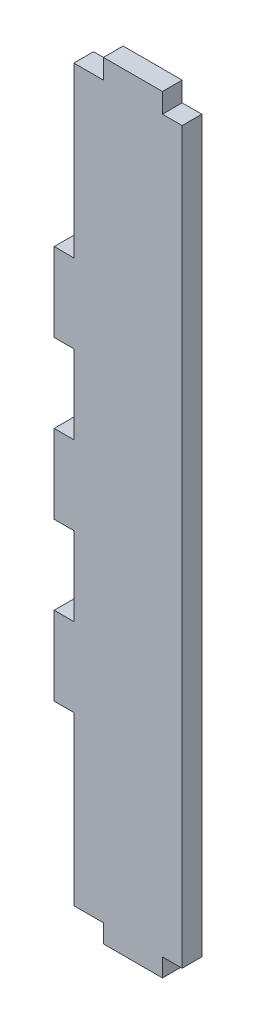
ISO-10303-21;
HEADER;
FILE_DESCRIPTION(('STEP AP214'),'2;1');
FILE_NAME('part.step','',(''),(''),'','','');
FILE_SCHEMA(('AUTOMOTIVE_DESIGN { 1 0 10303 214 1 1 1 1 }'));
ENDSEC;
DATA;
#1=APPLICATION_CONTEXT('core data for automotive mechanical design processes');
#2=APPLICATION_PROTOCOL_DEFINITION('international standard','automotive_design',2000,#1);
#3=PRODUCT_CONTEXT('',#1,'mechanical');
#4=PRODUCT('Part','Part','',(#3));
#5=PRODUCT_RELATED_PRODUCT_CATEGORY('part','',(#4));
#6=PRODUCT_DEFINITION_FORMATION('','',#4);
#7=PRODUCT_DEFINITION_CONTEXT('part definition',#1,'design');
#8=PRODUCT_DEFINITION('design','',#6,#7);
#9=PRODUCT_DEFINITION_SHAPE('','',#8);
#10=(LENGTH_UNIT() NAMED_UNIT(*) SI_UNIT(.MILLI.,.METRE.));
#11=(NAMED_UNIT(*) PLANE_ANGLE_UNIT() SI_UNIT($,.RADIAN.));
#12=(NAMED_UNIT(*) SI_UNIT($,.STERADIAN.) SOLID_ANGLE_UNIT());
#13=UNCERTAINTY_MEASURE_WITH_UNIT(LENGTH_MEASURE(1.E-05),#10,'distance_accuracy_value','');
#14=(GEOMETRIC_REPRESENTATION_CONTEXT(3) GLOBAL_UNCERTAINTY_ASSIGNED_CONTEXT((#13)) GLOBAL_UNIT_ASSIGNED_CONTEXT((#10,
#11,#12)) REPRESENTATION_CONTEXT('',''));
#15=CARTESIAN_POINT('',(0.,0.,0.));
#16=DIRECTION('',(0.,0.,1.));
#17=DIRECTION('',(1.,0.,0.));
#18=AXIS2_PLACEMENT_3D('',#15,#16,#17);
#19=CARTESIAN_POINT('',(-6.80011602582928E-13,122.500000000001,-5.));
#20=DIRECTION('',(0.,1.,0.));
#21=DIRECTION('',(-1.,0.,0.));
#22=AXIS2_PLACEMENT_3D('',#19,#20,#21);
#23=PLANE('',#22);
#24=DIRECTION('',(-1.,0.,0.));
#25=VECTOR('',#24,1.);
#26=CARTESIAN_POINT('',(-6.80011602582928E-13,122.500000000001,0.));
#27=LINE('',#26,#25);
#28=CARTESIAN_POINT('',(24.9999999999859,122.500000000001,0.));
#29=VERTEX_POINT('',#28);
#30=CARTESIAN_POINT('',(19.999999999986,122.500000000001,0.));
#31=VERTEX_POINT('',#30);
#32=EDGE_CURVE('E231',#29,#31,#27,.T.);
#33=ORIENTED_EDGE('',*,*,#32,.T.);
#34=DIRECTION('',(0.,0.,1.));
#35=VECTOR('',#34,1.);
#36=CARTESIAN_POINT('',(19.999999999986,122.500000000001,-5.));
#37=LINE('',#36,#35);
#38=CARTESIAN_POINT('',(19.999999999986,122.500000000001,-5.));
#39=VERTEX_POINT('',#38);
#40=EDGE_CURVE('E11',#39,#31,#37,.T.);
#41=ORIENTED_EDGE('',*,*,#40,.F.);
#42=DIRECTION('',(-1.,0.,0.));
#43=VECTOR('',#42,1.);
#44=CARTESIAN_POINT('',(-6.80011602582928E-13,122.500000000001,-5.));
#45=LINE('',#44,#43);
#46=CARTESIAN_POINT('',(24.9999999999859,122.500000000001,-5.));
#47=VERTEX_POINT('',#46);
#48=EDGE_CURVE('E294',#47,#39,#45,.T.);
#49=ORIENTED_EDGE('',*,*,#48,.F.);
#50=DIRECTION('',(0.,0.,1.));
#51=VECTOR('',#50,1.);
#52=CARTESIAN_POINT('',(24.9999999999859,122.500000000001,-5.));
#53=LINE('',#52,#51);
#54=EDGE_CURVE('E42',#47,#29,#53,.T.);
#55=ORIENTED_EDGE('',*,*,#54,.T.);
#56=EDGE_LOOP('',(#33,#41,#49,#55));
#57=FACE_BOUND('',#56,.T.);
#58=ADVANCED_FACE('F39',(#57),#23,.F.);
#59=CARTESIAN_POINT('',(19.999999999986,0.,-5.));
#60=DIRECTION('',(1.,0.,0.));
#61=DIRECTION('',(0.,0.,-1.));
#62=AXIS2_PLACEMENT_3D('',#59,#60,#61);
#63=PLANE('',#62);
#64=DIRECTION('',(0.,1.,0.));
#65=VECTOR('',#64,1.);
#66=CARTESIAN_POINT('',(19.999999999986,0.,0.));
#67=LINE('',#66,#65);
#68=CARTESIAN_POINT('',(19.999999999986,142.500000000001,0.));
#69=VERTEX_POINT('',#68);
#70=EDGE_CURVE('E138',#31,#69,#67,.T.);
#71=ORIENTED_EDGE('',*,*,#70,.T.);
#72=DIRECTION('',(0.,0.,1.));
#73=VECTOR('',#72,1.);
#74=CARTESIAN_POINT('',(19.999999999986,142.500000000001,-5.));
#75=LINE('',#74,#73);
#76=CARTESIAN_POINT('',(19.999999999986,142.500000000001,-5.));
#77=VERTEX_POINT('',#76);
#78=EDGE_CURVE('E48',#77,#69,#75,.T.);
#79=ORIENTED_EDGE('',*,*,#78,.F.);
#80=DIRECTION('',(0.,1.,0.));
#81=VECTOR('',#80,1.);
#82=CARTESIAN_POINT('',(19.999999999986,0.,-5.));
#83=LINE('',#82,#81);
#84=EDGE_CURVE('E56',#39,#77,#83,.T.);
#85=ORIENTED_EDGE('',*,*,#84,.F.);
#86=ORIENTED_EDGE('',*,*,#40,.T.);
#87=EDGE_LOOP('',(#71,#79,#85,#86));
#88=FACE_BOUND('',#87,.T.);
#89=ADVANCED_FACE('F354',(#88),#63,.F.);
#90=CARTESIAN_POINT('',(-7.91033905045446E-13,142.500000000001,-5.));
#91=DIRECTION('',(0.,1.,0.));
#92=DIRECTION('',(-1.,0.,0.));
#93=AXIS2_PLACEMENT_3D('',#90,#91,#92);
#94=PLANE('',#93);
#95=DIRECTION('',(-1.,0.,0.));
#96=VECTOR('',#95,1.);
#97=CARTESIAN_POINT('',(-7.91033905045446E-13,142.500000000001,0.));
#98=LINE('',#97,#96);
#99=CARTESIAN_POINT('',(24.9999999999859,142.500000000001,0.));
#100=VERTEX_POINT('',#99);
#101=EDGE_CURVE('E210',#100,#69,#98,.T.);
#102=ORIENTED_EDGE('',*,*,#101,.F.);
#103=DIRECTION('',(0.,0.,1.));
#104=VECTOR('',#103,1.);
#105=CARTESIAN_POINT('',(24.9999999999859,142.500000000001,-5.));
#106=LINE('',#105,#104);
#107=CARTESIAN_POINT('',(24.9999999999859,142.500000000001,-5.));
#108=VERTEX_POINT('',#107);
#109=EDGE_CURVE('E206',#108,#100,#106,.T.);
#110=ORIENTED_EDGE('',*,*,#109,.F.);
#111=DIRECTION('',(-1.,0.,0.));
#112=VECTOR('',#111,1.);
#113=CARTESIAN_POINT('',(-7.91033905045446E-13,142.500000000001,-5.));
#114=LINE('',#113,#112);
#115=EDGE_CURVE('E209',#108,#77,#114,.T.);
#116=ORIENTED_EDGE('',*,*,#115,.T.);
#117=ORIENTED_EDGE('',*,*,#78,.T.);
#118=EDGE_LOOP('',(#102,#110,#116,#117));
#119=FACE_BOUND('',#118,.T.);
#120=ADVANCED_FACE('F208',(#119),#94,.T.);
#121=CARTESIAN_POINT('',(24.9999999999769,-1.58057395948201E-12,-5.));
#122=DIRECTION('',(-1.,0.,0.));
#123=DIRECTION('',(0.,-1.,0.));
#124=AXIS2_PLACEMENT_3D('',#121,#122,#123);
#125=PLANE('',#124);
#126=DIRECTION('',(0.,-1.,0.));
#127=VECTOR('',#126,1.);
#128=CARTESIAN_POINT('',(24.9999999999769,-1.58057395948201E-12,0.));
#129=LINE('',#128,#127);
#130=CARTESIAN_POINT('',(24.9999999999886,185.358451090156,0.));
#131=VERTEX_POINT('',#130);
#132=EDGE_CURVE('E291',#131,#100,#129,.T.);
#133=ORIENTED_EDGE('',*,*,#132,.F.);
#134=DIRECTION('',(0.,0.,1.));
#135=VECTOR('',#134,1.);
#136=CARTESIAN_POINT('',(24.9999999999886,185.358451090156,-5.));
#137=LINE('',#136,#135);
#138=CARTESIAN_POINT('',(24.9999999999886,185.358451090156,-5.));
#139=VERTEX_POINT('',#138);
#140=EDGE_CURVE('E215',#139,#131,#137,.T.);
#141=ORIENTED_EDGE('',*,*,#140,.F.);
#142=DIRECTION('',(0.,-1.,0.));
#143=VECTOR('',#142,1.);
#144=CARTESIAN_POINT('',(24.9999999999769,-1.58057395948201E-12,-5.));
#145=LINE('',#144,#143);
#146=EDGE_CURVE('E220',#139,#108,#145,.T.);
#147=ORIENTED_EDGE('',*,*,#146,.T.);
#148=ORIENTED_EDGE('',*,*,#109,.T.);
#149=EDGE_LOOP('',(#133,#141,#147,#148));
#150=FACE_BOUND('',#149,.T.);
#151=ADVANCED_FACE('F222',(#150),#125,.T.);
#152=CARTESIAN_POINT('',(0.,185.358451090156,-5.));
#153=DIRECTION('',(0.,-1.,0.));
#154=DIRECTION('',(0.,0.,-1.));
#155=AXIS2_PLACEMENT_3D('',#152,#153,#154);
#156=PLANE('',#155);
#157=DIRECTION('',(1.,0.,0.));
#158=VECTOR('',#157,1.);
#159=CARTESIAN_POINT('',(0.,185.358451090156,0.));
#160=LINE('',#159,#158);
#161=CARTESIAN_POINT('',(32.4999999999886,185.358451090156,0.));
#162=VERTEX_POINT('',#161);
#163=EDGE_CURVE('E289',#131,#162,#160,.T.);
#164=ORIENTED_EDGE('',*,*,#163,.T.);
#165=DIRECTION('',(0.,0.,1.));
#166=VECTOR('',#165,1.);
#167=CARTESIAN_POINT('',(32.4999999999886,185.358451090156,-5.));
#168=LINE('',#167,#166);
#169=CARTESIAN_POINT('',(32.4999999999886,185.358451090156,-5.));
#170=VERTEX_POINT('',#169);
#171=EDGE_CURVE('E298',#170,#162,#168,.T.);
#172=ORIENTED_EDGE('',*,*,#171,.F.);
#173=DIRECTION('',(1.,0.,0.));
#174=VECTOR('',#173,1.);
#175=CARTESIAN_POINT('',(0.,185.358451090156,-5.));
#176=LINE('',#175,#174);
#177=EDGE_CURVE('E224',#139,#170,#176,.T.);
#178=ORIENTED_EDGE('',*,*,#177,.F.);
#179=ORIENTED_EDGE('',*,*,#140,.T.);
#180=EDGE_LOOP('',(#164,#172,#178,#179));
#181=FACE_BOUND('',#180,.T.);
#182=ADVANCED_FACE('F367',(#181),#156,.F.);
#183=CARTESIAN_POINT('',(32.4999999999886,0.,-5.));
#184=DIRECTION('',(1.,0.,0.));
#185=DIRECTION('',(0.,0.,-1.));
#186=AXIS2_PLACEMENT_3D('',#183,#184,#185);
#187=PLANE('',#186);
#188=DIRECTION('',(0.,1.,0.));
#189=VECTOR('',#188,1.);
#190=CARTESIAN_POINT('',(32.4999999999886,0.,0.));
#191=LINE('',#190,#189);
#192=CARTESIAN_POINT('',(32.4999999999886,190.358451090156,0.));
#193=VERTEX_POINT('',#192);
#194=EDGE_CURVE('E286',#162,#193,#191,.T.);
#195=ORIENTED_EDGE('',*,*,#194,.T.);
#196=DIRECTION('',(0.,0.,1.));
#197=VECTOR('',#196,1.);
#198=CARTESIAN_POINT('',(32.4999999999886,190.358451090156,-5.));
#199=LINE('',#198,#197);
#200=CARTESIAN_POINT('',(32.4999999999886,190.358451090156,-5.));
#201=VERTEX_POINT('',#200);
#202=EDGE_CURVE('E301',#201,#193,#199,.T.);
#203=ORIENTED_EDGE('',*,*,#202,.F.);
#204=DIRECTION('',(0.,1.,0.));
#205=VECTOR('',#204,1.);
#206=CARTESIAN_POINT('',(32.4999999999886,0.,-5.));
#207=LINE('',#206,#205);
#208=EDGE_CURVE('E226',#170,#201,#207,.T.);
#209=ORIENTED_EDGE('',*,*,#208,.F.);
#210=ORIENTED_EDGE('',*,*,#171,.T.);
#211=EDGE_LOOP('',(#195,#203,#209,#210));
#212=FACE_BOUND('',#211,.T.);
#213=ADVANCED_FACE('F370',(#212),#187,.F.);
#214=CARTESIAN_POINT('',(0.,190.358451090156,-5.));
#215=DIRECTION('',(0.,1.,0.));
#216=DIRECTION('',(0.,0.,1.));
#217=AXIS2_PLACEMENT_3D('',#214,#215,#216);
#218=PLANE('',#217);
#219=DIRECTION('',(-1.,0.,0.));
#220=VECTOR('',#219,1.);
#221=CARTESIAN_POINT('',(0.,190.358451090156,0.));
#222=LINE('',#221,#220);
#223=CARTESIAN_POINT('',(47.4999999999886,190.358451090156,0.));
#224=VERTEX_POINT('',#223);
#225=EDGE_CURVE('E283',#224,#193,#222,.T.);
#226=ORIENTED_EDGE('',*,*,#225,.F.);
#227=DIRECTION('',(0.,0.,1.));
#228=VECTOR('',#227,1.);
#229=CARTESIAN_POINT('',(47.4999999999886,190.358451090156,-5.));
#230=LINE('',#229,#228);
#231=CARTESIAN_POINT('',(47.4999999999886,190.358451090156,-5.));
#232=VERTEX_POINT('',#231);
#233=EDGE_CURVE('E303',#232,#224,#230,.T.);
#234=ORIENTED_EDGE('',*,*,#233,.F.);
#235=DIRECTION('',(-1.,0.,0.));
#236=VECTOR('',#235,1.);
#237=CARTESIAN_POINT('',(0.,190.358451090156,-5.));
#238=LINE('',#237,#236);
#239=EDGE_CURVE('E490',#232,#201,#238,.T.);
#240=ORIENTED_EDGE('',*,*,#239,.T.);
#241=ORIENTED_EDGE('',*,*,#202,.T.);
#242=EDGE_LOOP('',(#226,#234,#240,#241));
#243=FACE_BOUND('',#242,.T.);
#244=ADVANCED_FACE('F374',(#243),#218,.T.);
#245=CARTESIAN_POINT('',(47.4999999999886,0.,-5.));
#246=DIRECTION('',(1.,0.,0.));
#247=DIRECTION('',(0.,0.,-1.));
#248=AXIS2_PLACEMENT_3D('',#245,#246,#247);
#249=PLANE('',#248);
#250=DIRECTION('',(0.,1.,0.));
#251=VECTOR('',#250,1.);
#252=CARTESIAN_POINT('',(47.4999999999886,0.,0.));
#253=LINE('',#252,#251);
#254=CARTESIAN_POINT('',(47.4999999999886,185.358451090156,0.));
#255=VERTEX_POINT('',#254);
#256=EDGE_CURVE('E280',#255,#224,#253,.T.);
#257=ORIENTED_EDGE('',*,*,#256,.F.);
#258=DIRECTION('',(0.,0.,1.));
#259=VECTOR('',#258,1.);
#260=CARTESIAN_POINT('',(47.4999999999886,185.358451090156,-5.));
#261=LINE('',#260,#259);
#262=CARTESIAN_POINT('',(47.4999999999886,185.358451090156,-5.));
#263=VERTEX_POINT('',#262);
#264=EDGE_CURVE('E305',#263,#255,#261,.T.);
#265=ORIENTED_EDGE('',*,*,#264,.F.);
#266=DIRECTION('',(0.,1.,0.));
#267=VECTOR('',#266,1.);
#268=CARTESIAN_POINT('',(47.4999999999886,0.,-5.));
#269=LINE('',#268,#267);
#270=EDGE_CURVE('E487',#263,#232,#269,.T.);
#271=ORIENTED_EDGE('',*,*,#270,.T.);
#272=ORIENTED_EDGE('',*,*,#233,.T.);
#273=EDGE_LOOP('',(#257,#265,#271,#272));
#274=FACE_BOUND('',#273,.T.);
#275=ADVANCED_FACE('F378',(#274),#249,.T.);
#276=CARTESIAN_POINT('',(0.,185.358451090156,-5.));
#277=DIRECTION('',(0.,-1.,0.));
#278=DIRECTION('',(0.,0.,-1.));
#279=AXIS2_PLACEMENT_3D('',#276,#277,#278);
#280=PLANE('',#279);
#281=DIRECTION('',(1.,0.,0.));
#282=VECTOR('',#281,1.);
#283=CARTESIAN_POINT('',(0.,185.358451090156,0.));
#284=LINE('',#283,#282);
#285=CARTESIAN_POINT('',(52.4999999999886,185.358451090156,0.));
#286=VERTEX_POINT('',#285);
#287=EDGE_CURVE('E277',#255,#286,#284,.T.);
#288=ORIENTED_EDGE('',*,*,#287,.T.);
#289=DIRECTION('',(0.,0.,1.));
#290=VECTOR('',#289,1.);
#291=CARTESIAN_POINT('',(52.4999999999886,185.358451090156,-5.));
#292=LINE('',#291,#290);
#293=CARTESIAN_POINT('',(52.4999999999886,185.358451090156,-5.));
#294=VERTEX_POINT('',#293);
#295=EDGE_CURVE('E307',#294,#286,#292,.T.);
#296=ORIENTED_EDGE('',*,*,#295,.F.);
#297=DIRECTION('',(1.,0.,0.));
#298=VECTOR('',#297,1.);
#299=CARTESIAN_POINT('',(0.,185.358451090156,-5.));
#300=LINE('',#299,#298);
#301=EDGE_CURVE('E485',#263,#294,#300,.T.);
#302=ORIENTED_EDGE('',*,*,#301,.F.);
#303=ORIENTED_EDGE('',*,*,#264,.T.);
#304=EDGE_LOOP('',(#288,#296,#302,#303));
#305=FACE_BOUND('',#304,.T.);
#306=ADVANCED_FACE('F382',(#305),#280,.F.);
#307=CARTESIAN_POINT('',(52.4999999999886,0.,-5.));
#308=DIRECTION('',(1.,0.,0.));
#309=DIRECTION('',(0.,0.,-1.));
#310=AXIS2_PLACEMENT_3D('',#307,#308,#309);
#311=PLANE('',#310);
#312=DIRECTION('',(0.,1.,0.));
#313=VECTOR('',#312,1.);
#314=CARTESIAN_POINT('',(52.4999999999886,0.,0.));
#315=LINE('',#314,#313);
#316=CARTESIAN_POINT('',(52.4999999999886,0.,0.));
#317=VERTEX_POINT('',#316);
#318=EDGE_CURVE('E274',#317,#286,#315,.T.);
#319=ORIENTED_EDGE('',*,*,#318,.F.);
#320=DIRECTION('',(0.,0.,1.));
#321=VECTOR('',#320,1.);
#322=CARTESIAN_POINT('',(52.4999999999886,0.,-5.));
#323=LINE('',#322,#321);
#324=CARTESIAN_POINT('',(52.4999999999886,0.,-5.));
#325=VERTEX_POINT('',#324);
#326=EDGE_CURVE('E309',#325,#317,#323,.T.);
#327=ORIENTED_EDGE('',*,*,#326,.F.);
#328=DIRECTION('',(0.,1.,0.));
#329=VECTOR('',#328,1.);
#330=CARTESIAN_POINT('',(52.4999999999886,0.,-5.));
#331=LINE('',#330,#329);
#332=EDGE_CURVE('E482',#325,#294,#331,.T.);
#333=ORIENTED_EDGE('',*,*,#332,.T.);
#334=ORIENTED_EDGE('',*,*,#295,.T.);
#335=EDGE_LOOP('',(#319,#327,#333,#334));
#336=FACE_BOUND('',#335,.T.);
#337=ADVANCED_FACE('F386',(#336),#311,.T.);
#338=CARTESIAN_POINT('',(0.,0.,-5.));
#339=DIRECTION('',(0.,-1.,0.));
#340=DIRECTION('',(0.,0.,-1.));
#341=AXIS2_PLACEMENT_3D('',#338,#339,#340);
#342=PLANE('',#341);
#343=DIRECTION('',(1.,0.,0.));
#344=VECTOR('',#343,1.);
#345=CARTESIAN_POINT('',(0.,0.,0.));
#346=LINE('',#345,#344);
#347=CARTESIAN_POINT('',(47.4999999999886,0.,0.));
#348=VERTEX_POINT('',#347);
#349=EDGE_CURVE('E271',#348,#317,#346,.T.);
#350=ORIENTED_EDGE('',*,*,#349,.F.);
#351=DIRECTION('',(0.,0.,1.));
#352=VECTOR('',#351,1.);
#353=CARTESIAN_POINT('',(47.4999999999886,0.,-5.));
#354=LINE('',#353,#352);
#355=CARTESIAN_POINT('',(47.4999999999886,0.,-5.));
#356=VERTEX_POINT('',#355);
#357=EDGE_CURVE('E311',#356,#348,#354,.T.);
#358=ORIENTED_EDGE('',*,*,#357,.F.);
#359=DIRECTION('',(1.,0.,0.));
#360=VECTOR('',#359,1.);
#361=CARTESIAN_POINT('',(0.,0.,-5.));
#362=LINE('',#361,#360);
#363=EDGE_CURVE('E479',#356,#325,#362,.T.);
#364=ORIENTED_EDGE('',*,*,#363,.T.);
#365=ORIENTED_EDGE('',*,*,#326,.T.);
#366=EDGE_LOOP('',(#350,#358,#364,#365));
#367=FACE_BOUND('',#366,.T.);
#368=ADVANCED_FACE('F390',(#367),#342,.T.);
#369=CARTESIAN_POINT('',(47.4999999999886,0.,-5.));
#370=DIRECTION('',(1.,0.,0.));
#371=DIRECTION('',(0.,0.,-1.));
#372=AXIS2_PLACEMENT_3D('',#369,#370,#371);
#373=PLANE('',#372);
#374=DIRECTION('',(0.,1.,0.));
#375=VECTOR('',#374,1.);
#376=CARTESIAN_POINT('',(47.4999999999886,0.,0.));
#377=LINE('',#376,#375);
#378=CARTESIAN_POINT('',(47.4999999999886,-4.64154890983693,0.));
#379=VERTEX_POINT('',#378);
#380=EDGE_CURVE('E268',#379,#348,#377,.T.);
#381=ORIENTED_EDGE('',*,*,#380,.F.);
#382=DIRECTION('',(0.,0.,1.));
#383=VECTOR('',#382,1.);
#384=CARTESIAN_POINT('',(47.4999999999886,-4.64154890983693,-5.));
#385=LINE('',#384,#383);
#386=CARTESIAN_POINT('',(47.4999999999886,-4.64154890983693,-5.));
#387=VERTEX_POINT('',#386);
#388=EDGE_CURVE('E313',#387,#379,#385,.T.);
#389=ORIENTED_EDGE('',*,*,#388,.F.);
#390=DIRECTION('',(0.,1.,0.));
#391=VECTOR('',#390,1.);
#392=CARTESIAN_POINT('',(47.4999999999886,0.,-5.));
#393=LINE('',#392,#391);
#394=EDGE_CURVE('E476',#387,#356,#393,.T.);
#395=ORIENTED_EDGE('',*,*,#394,.T.);
#396=ORIENTED_EDGE('',*,*,#357,.T.);
#397=EDGE_LOOP('',(#381,#389,#395,#396));
#398=FACE_BOUND('',#397,.T.);
#399=ADVANCED_FACE('F394',(#398),#373,.T.);
#400=CARTESIAN_POINT('',(0.,-4.64154890983693,-5.));
#401=DIRECTION('',(0.,1.,0.));
#402=DIRECTION('',(0.,0.,1.));
#403=AXIS2_PLACEMENT_3D('',#400,#401,#402);
#404=PLANE('',#403);
#405=DIRECTION('',(-1.,0.,0.));
#406=VECTOR('',#405,1.);
#407=CARTESIAN_POINT('',(0.,-4.64154890983693,0.));
#408=LINE('',#407,#406);
#409=CARTESIAN_POINT('',(32.4999999999886,-4.64154890983693,0.));
#410=VERTEX_POINT('',#409);
#411=EDGE_CURVE('E266',#379,#410,#408,.T.);
#412=ORIENTED_EDGE('',*,*,#411,.T.);
#413=DIRECTION('',(0.,0.,1.));
#414=VECTOR('',#413,1.);
#415=CARTESIAN_POINT('',(32.4999999999886,-4.64154890983693,-5.));
#416=LINE('',#415,#414);
#417=CARTESIAN_POINT('',(32.4999999999886,-4.64154890983693,-5.));
#418=VERTEX_POINT('',#417);
#419=EDGE_CURVE('E315',#418,#410,#416,.T.);
#420=ORIENTED_EDGE('',*,*,#419,.F.);
#421=DIRECTION('',(-1.,0.,0.));
#422=VECTOR('',#421,1.);
#423=CARTESIAN_POINT('',(0.,-4.64154890983693,-5.));
#424=LINE('',#423,#422);
#425=EDGE_CURVE('E474',#387,#418,#424,.T.);
#426=ORIENTED_EDGE('',*,*,#425,.F.);
#427=ORIENTED_EDGE('',*,*,#388,.T.);
#428=EDGE_LOOP('',(#412,#420,#426,#427));
#429=FACE_BOUND('',#428,.T.);
#430=ADVANCED_FACE('F398',(#429),#404,.F.);
#431=CARTESIAN_POINT('',(32.4999999999829,3.95975472519805E-11,-5.));
#432=DIRECTION('',(1.,1.21838606929235E-12,0.));
#433=DIRECTION('',(-1.21838606929235E-12,1.,0.));
#434=AXIS2_PLACEMENT_3D('',#431,#432,#433);
#435=PLANE('',#434);
#436=DIRECTION('',(-1.21838606929235E-12,1.,0.));
#437=VECTOR('',#436,1.);
#438=CARTESIAN_POINT('',(32.4999999999829,3.95975472519805E-11,0.));
#439=LINE('',#438,#437);
#440=CARTESIAN_POINT('',(32.4999999999829,0.,0.));
#441=VERTEX_POINT('',#440);
#442=EDGE_CURVE('E264',#410,#441,#439,.T.);
#443=ORIENTED_EDGE('',*,*,#442,.T.);
#444=DIRECTION('',(0.,0.,1.));
#445=VECTOR('',#444,1.);
#446=CARTESIAN_POINT('',(32.4999999999829,0.,-5.));
#447=LINE('',#446,#445);
#448=CARTESIAN_POINT('',(32.4999999999829,0.,-5.));
#449=VERTEX_POINT('',#448);
#450=EDGE_CURVE('E318',#449,#441,#447,.T.);
#451=ORIENTED_EDGE('',*,*,#450,.F.);
#452=DIRECTION('',(-1.21838606929235E-12,1.,0.));
#453=VECTOR('',#452,1.);
#454=CARTESIAN_POINT('',(32.4999999999829,3.95975472519805E-11,-5.));
#455=LINE('',#454,#453);
#456=EDGE_CURVE('E472',#418,#449,#455,.T.);
#457=ORIENTED_EDGE('',*,*,#456,.F.);
#458=ORIENTED_EDGE('',*,*,#419,.T.);
#459=EDGE_LOOP('',(#443,#451,#457,#458));
#460=FACE_BOUND('',#459,.T.);
#461=ADVANCED_FACE('F402',(#460),#435,.F.);
#462=CARTESIAN_POINT('',(0.,0.,-5.));
#463=DIRECTION('',(0.,1.,0.));
#464=DIRECTION('',(0.,0.,1.));
#465=AXIS2_PLACEMENT_3D('',#462,#463,#464);
#466=PLANE('',#465);
#467=DIRECTION('',(-1.,0.,0.));
#468=VECTOR('',#467,1.);
#469=CARTESIAN_POINT('',(0.,0.,0.));
#470=LINE('',#469,#468);
#471=CARTESIAN_POINT('',(24.999999999983,0.,0.));
#472=VERTEX_POINT('',#471);
#473=EDGE_CURVE('E261',#441,#472,#470,.T.);
#474=ORIENTED_EDGE('',*,*,#473,.T.);
#475=DIRECTION('',(0.,0.,1.));
#476=VECTOR('',#475,1.);
#477=CARTESIAN_POINT('',(24.999999999983,0.,-5.));
#478=LINE('',#477,#476);
#479=CARTESIAN_POINT('',(24.999999999983,0.,-5.));
#480=VERTEX_POINT('',#479);
#481=EDGE_CURVE('E321',#480,#472,#478,.T.);
#482=ORIENTED_EDGE('',*,*,#481,.F.);
#483=DIRECTION('',(-1.,0.,0.));
#484=VECTOR('',#483,1.);
#485=CARTESIAN_POINT('',(0.,0.,-5.));
#486=LINE('',#485,#484);
#487=EDGE_CURVE('E470',#449,#480,#486,.T.);
#488=ORIENTED_EDGE('',*,*,#487,.F.);
#489=ORIENTED_EDGE('',*,*,#450,.T.);
#490=EDGE_LOOP('',(#474,#482,#488,#489));
#491=FACE_BOUND('',#490,.T.);
#492=ADVANCED_FACE('F406',(#491),#466,.F.);
#493=CARTESIAN_POINT('',(24.999999999983,-1.70206985760412E-12,-5.));
#494=DIRECTION('',(-1.,0.,0.));
#495=DIRECTION('',(0.,-1.,0.));
#496=AXIS2_PLACEMENT_3D('',#493,#494,#495);
#497=PLANE('',#496);
#498=DIRECTION('',(0.,-1.,0.));
#499=VECTOR('',#498,1.);
#500=CARTESIAN_POINT('',(24.999999999983,-1.70206985760412E-12,0.));
#501=LINE('',#500,#499);
#502=CARTESIAN_POINT('',(24.9999999999859,42.500000000005,0.));
#503=VERTEX_POINT('',#502);
#504=EDGE_CURVE('E258',#503,#472,#501,.T.);
#505=ORIENTED_EDGE('',*,*,#504,.F.);
#506=DIRECTION('',(0.,0.,1.));
#507=VECTOR('',#506,1.);
#508=CARTESIAN_POINT('',(24.9999999999859,42.500000000005,-5.));
#509=LINE('',#508,#507);
#510=CARTESIAN_POINT('',(24.9999999999859,42.500000000005,-5.));
#511=VERTEX_POINT('',#510);
#512=EDGE_CURVE('E323',#511,#503,#509,.T.);
#513=ORIENTED_EDGE('',*,*,#512,.F.);
#514=DIRECTION('',(0.,-1.,0.));
#515=VECTOR('',#514,1.);
#516=CARTESIAN_POINT('',(24.999999999983,-1.70206985760412E-12,-5.));
#517=LINE('',#516,#515);
#518=EDGE_CURVE('E467',#511,#480,#517,.T.);
#519=ORIENTED_EDGE('',*,*,#518,.T.);
#520=ORIENTED_EDGE('',*,*,#481,.T.);
#521=EDGE_LOOP('',(#505,#513,#519,#520));
#522=FACE_BOUND('',#521,.T.);
#523=ADVANCED_FACE('F410',(#522),#497,.T.);
#524=CARTESIAN_POINT('',(0.,42.500000000005,-5.));
#525=DIRECTION('',(0.,1.,0.));
#526=DIRECTION('',(0.,0.,1.));
#527=AXIS2_PLACEMENT_3D('',#524,#525,#526);
#528=PLANE('',#527);
#529=DIRECTION('',(-1.,0.,0.));
#530=VECTOR('',#529,1.);
#531=CARTESIAN_POINT('',(0.,42.500000000005,0.));
#532=LINE('',#531,#530);
#533=CARTESIAN_POINT('',(19.999999999986,42.500000000005,0.));
#534=VERTEX_POINT('',#533);
#535=EDGE_CURVE('E255',#503,#534,#532,.T.);
#536=ORIENTED_EDGE('',*,*,#535,.T.);
#537=DIRECTION('',(0.,0.,1.));
#538=VECTOR('',#537,1.);
#539=CARTESIAN_POINT('',(19.999999999986,42.500000000005,-5.));
#540=LINE('',#539,#538);
#541=CARTESIAN_POINT('',(19.999999999986,42.500000000005,-5.));
#542=VERTEX_POINT('',#541);
#543=EDGE_CURVE('E325',#542,#534,#540,.T.);
#544=ORIENTED_EDGE('',*,*,#543,.F.);
#545=DIRECTION('',(-1.,0.,0.));
#546=VECTOR('',#545,1.);
#547=CARTESIAN_POINT('',(0.,42.500000000005,-5.));
#548=LINE('',#547,#546);
#549=EDGE_CURVE('E465',#511,#542,#548,.T.);
#550=ORIENTED_EDGE('',*,*,#549,.F.);
#551=ORIENTED_EDGE('',*,*,#512,.T.);
#552=EDGE_LOOP('',(#536,#544,#550,#551));
#553=FACE_BOUND('',#552,.T.);
#554=ADVANCED_FACE('F414',(#553),#528,.F.);
#555=CARTESIAN_POINT('',(19.999999999986,0.,-5.));
#556=DIRECTION('',(-1.,0.,0.));
#557=DIRECTION('',(0.,0.,1.));
#558=AXIS2_PLACEMENT_3D('',#555,#556,#557);
#559=PLANE('',#558);
#560=DIRECTION('',(0.,-1.,0.));
#561=VECTOR('',#560,1.);
#562=CARTESIAN_POINT('',(19.999999999986,0.,0.));
#563=LINE('',#562,#561);
#564=CARTESIAN_POINT('',(19.999999999986,62.5000000000049,0.));
#565=VERTEX_POINT('',#564);
#566=EDGE_CURVE('E252',#565,#534,#563,.T.);
#567=ORIENTED_EDGE('',*,*,#566,.F.);
#568=DIRECTION('',(0.,0.,1.));
#569=VECTOR('',#568,1.);
#570=CARTESIAN_POINT('',(19.999999999986,62.5000000000049,-5.));
#571=LINE('',#570,#569);
#572=CARTESIAN_POINT('',(19.999999999986,62.5000000000049,-5.));
#573=VERTEX_POINT('',#572);
#574=EDGE_CURVE('E327',#573,#565,#571,.T.);
#575=ORIENTED_EDGE('',*,*,#574,.F.);
#576=DIRECTION('',(0.,-1.,0.));
#577=VECTOR('',#576,1.);
#578=CARTESIAN_POINT('',(19.999999999986,0.,-5.));
#579=LINE('',#578,#577);
#580=EDGE_CURVE('E462',#573,#542,#579,.T.);
#581=ORIENTED_EDGE('',*,*,#580,.T.);
#582=ORIENTED_EDGE('',*,*,#543,.T.);
#583=EDGE_LOOP('',(#567,#575,#581,#582));
#584=FACE_BOUND('',#583,.T.);
#585=ADVANCED_FACE('F418',(#584),#559,.T.);
#586=CARTESIAN_POINT('',(0.,62.5000000000049,-5.));
#587=DIRECTION('',(0.,1.,0.));
#588=DIRECTION('',(0.,0.,1.));
#589=AXIS2_PLACEMENT_3D('',#586,#587,#588);
#590=PLANE('',#589);
#591=DIRECTION('',(-1.,0.,0.));
#592=VECTOR('',#591,1.);
#593=CARTESIAN_POINT('',(0.,62.5000000000049,0.));
#594=LINE('',#593,#592);
#595=CARTESIAN_POINT('',(24.9999999999859,62.5000000000049,0.));
#596=VERTEX_POINT('',#595);
#597=EDGE_CURVE('E249',#596,#565,#594,.T.);
#598=ORIENTED_EDGE('',*,*,#597,.F.);
#599=DIRECTION('',(0.,0.,1.));
#600=VECTOR('',#599,1.);
#601=CARTESIAN_POINT('',(24.9999999999859,62.5000000000049,-5.));
#602=LINE('',#601,#600);
#603=CARTESIAN_POINT('',(24.9999999999859,62.5000000000049,-5.));
#604=VERTEX_POINT('',#603);
#605=EDGE_CURVE('E329',#604,#596,#602,.T.);
#606=ORIENTED_EDGE('',*,*,#605,.F.);
#607=DIRECTION('',(-1.,0.,0.));
#608=VECTOR('',#607,1.);
#609=CARTESIAN_POINT('',(0.,62.5000000000049,-5.));
#610=LINE('',#609,#608);
#611=EDGE_CURVE('E459',#604,#573,#610,.T.);
#612=ORIENTED_EDGE('',*,*,#611,.T.);
#613=ORIENTED_EDGE('',*,*,#574,.T.);
#614=EDGE_LOOP('',(#598,#606,#612,#613));
#615=FACE_BOUND('',#614,.T.);
#616=ADVANCED_FACE('F422',(#615),#590,.T.);
#617=CARTESIAN_POINT('',(24.9999999999774,-3.4043948216014E-12,-5.));
#618=DIRECTION('',(-1.,1.36175792864179E-13,0.));
#619=DIRECTION('',(-1.36175792864179E-13,-1.,0.));
#620=AXIS2_PLACEMENT_3D('',#617,#618,#619);
#621=PLANE('',#620);
#622=DIRECTION('',(-1.36175792864179E-13,-1.,0.));
#623=VECTOR('',#622,1.);
#624=CARTESIAN_POINT('',(24.9999999999774,-3.4043948216014E-12,0.));
#625=LINE('',#624,#623);
#626=CARTESIAN_POINT('',(24.9999999999886,82.500000000005,0.));
#627=VERTEX_POINT('',#626);
#628=EDGE_CURVE('E246',#627,#596,#625,.T.);
#629=ORIENTED_EDGE('',*,*,#628,.F.);
#630=DIRECTION('',(0.,0.,1.));
#631=VECTOR('',#630,1.);
#632=CARTESIAN_POINT('',(24.9999999999886,82.500000000005,-5.));
#633=LINE('',#632,#631);
#634=CARTESIAN_POINT('',(24.9999999999886,82.500000000005,-5.));
#635=VERTEX_POINT('',#634);
#636=EDGE_CURVE('E331',#635,#627,#633,.T.);
#637=ORIENTED_EDGE('',*,*,#636,.F.);
#638=DIRECTION('',(-1.36175792864179E-13,-1.,0.));
#639=VECTOR('',#638,1.);
#640=CARTESIAN_POINT('',(24.9999999999774,-3.4043948216014E-12,-5.));
#641=LINE('',#640,#639);
#642=EDGE_CURVE('E456',#635,#604,#641,.T.);
#643=ORIENTED_EDGE('',*,*,#642,.T.);
#644=ORIENTED_EDGE('',*,*,#605,.T.);
#645=EDGE_LOOP('',(#629,#637,#643,#644));
#646=FACE_BOUND('',#645,.T.);
#647=ADVANCED_FACE('F426',(#646),#621,.T.);
#648=CARTESIAN_POINT('',(0.,82.500000000005,-5.));
#649=DIRECTION('',(0.,1.,0.));
#650=DIRECTION('',(0.,0.,1.));
#651=AXIS2_PLACEMENT_3D('',#648,#649,#650);
#652=PLANE('',#651);
#653=DIRECTION('',(-1.,0.,0.));
#654=VECTOR('',#653,1.);
#655=CARTESIAN_POINT('',(0.,82.500000000005,0.));
#656=LINE('',#655,#654);
#657=CARTESIAN_POINT('',(19.9999999999887,82.500000000005,0.));
#658=VERTEX_POINT('',#657);
#659=EDGE_CURVE('E243',#627,#658,#656,.T.);
#660=ORIENTED_EDGE('',*,*,#659,.T.);
#661=DIRECTION('',(0.,0.,1.));
#662=VECTOR('',#661,1.);
#663=CARTESIAN_POINT('',(19.9999999999887,82.500000000005,-5.));
#664=LINE('',#663,#662);
#665=CARTESIAN_POINT('',(19.9999999999887,82.500000000005,-5.));
#666=VERTEX_POINT('',#665);
#667=EDGE_CURVE('E333',#666,#658,#664,.T.);
#668=ORIENTED_EDGE('',*,*,#667,.F.);
#669=DIRECTION('',(-1.,0.,0.));
#670=VECTOR('',#669,1.);
#671=CARTESIAN_POINT('',(0.,82.500000000005,-5.));
#672=LINE('',#671,#670);
#673=EDGE_CURVE('E450',#635,#666,#672,.T.);
#674=ORIENTED_EDGE('',*,*,#673,.F.);
#675=ORIENTED_EDGE('',*,*,#636,.T.);
#676=EDGE_LOOP('',(#660,#668,#674,#675));
#677=FACE_BOUND('',#676,.T.);
#678=ADVANCED_FACE('F430',(#677),#652,.F.);
#679=CARTESIAN_POINT('',(19.9999999999887,0.,-5.));
#680=DIRECTION('',(-1.,0.,0.));
#681=DIRECTION('',(0.,0.,1.));
#682=AXIS2_PLACEMENT_3D('',#679,#680,#681);
#683=PLANE('',#682);
#684=DIRECTION('',(0.,-1.,0.));
#685=VECTOR('',#684,1.);
#686=CARTESIAN_POINT('',(19.9999999999887,0.,0.));
#687=LINE('',#686,#685);
#688=CARTESIAN_POINT('',(19.9999999999887,102.500000000005,0.));
#689=VERTEX_POINT('',#688);
#690=EDGE_CURVE('E240',#689,#658,#687,.T.);
#691=ORIENTED_EDGE('',*,*,#690,.F.);
#692=DIRECTION('',(0.,0.,1.));
#693=VECTOR('',#692,1.);
#694=CARTESIAN_POINT('',(19.9999999999887,102.500000000005,-5.));
#695=LINE('',#694,#693);
#696=CARTESIAN_POINT('',(19.9999999999887,102.500000000005,-5.));
#697=VERTEX_POINT('',#696);
#698=EDGE_CURVE('E335',#697,#689,#695,.T.);
#699=ORIENTED_EDGE('',*,*,#698,.F.);
#700=DIRECTION('',(0.,-1.,0.));
#701=VECTOR('',#700,1.);
#702=CARTESIAN_POINT('',(19.9999999999887,0.,-5.));
#703=LINE('',#702,#701);
#704=EDGE_CURVE('E447',#697,#666,#703,.T.);
#705=ORIENTED_EDGE('',*,*,#704,.T.);
#706=ORIENTED_EDGE('',*,*,#667,.T.);
#707=EDGE_LOOP('',(#691,#699,#705,#706));
#708=FACE_BOUND('',#707,.T.);
#709=ADVANCED_FACE('F350',(#708),#683,.T.);
#710=CARTESIAN_POINT('',(0.,102.500000000005,-5.));
#711=DIRECTION('',(0.,1.,0.));
#712=DIRECTION('',(0.,0.,1.));
#713=AXIS2_PLACEMENT_3D('',#710,#711,#712);
#714=PLANE('',#713);
#715=DIRECTION('',(-1.,0.,0.));
#716=VECTOR('',#715,1.);
#717=CARTESIAN_POINT('',(0.,102.500000000005,0.));
#718=LINE('',#717,#716);
#719=CARTESIAN_POINT('',(24.9999999999886,102.500000000005,0.));
#720=VERTEX_POINT('',#719);
#721=EDGE_CURVE('E237',#720,#689,#718,.T.);
#722=ORIENTED_EDGE('',*,*,#721,.F.);
#723=DIRECTION('',(0.,0.,1.));
#724=VECTOR('',#723,1.);
#725=CARTESIAN_POINT('',(24.9999999999886,102.500000000005,-5.));
#726=LINE('',#725,#724);
#727=CARTESIAN_POINT('',(24.9999999999886,102.500000000005,-5.));
#728=VERTEX_POINT('',#727);
#729=EDGE_CURVE('E336',#728,#720,#726,.T.);
#730=ORIENTED_EDGE('',*,*,#729,.F.);
#731=DIRECTION('',(-1.,0.,0.));
#732=VECTOR('',#731,1.);
#733=CARTESIAN_POINT('',(0.,102.500000000005,-5.));
#734=LINE('',#733,#732);
#735=EDGE_CURVE('E446',#728,#697,#734,.T.);
#736=ORIENTED_EDGE('',*,*,#735,.T.);
#737=ORIENTED_EDGE('',*,*,#698,.T.);
#738=EDGE_LOOP('',(#722,#730,#736,#737));
#739=FACE_BOUND('',#738,.T.);
#740=ADVANCED_FACE('F344',(#739),#714,.T.);
#741=CARTESIAN_POINT('',(24.9999999999679,-3.664603342997E-12,-5.));
#742=DIRECTION('',(-1.,1.46584133720068E-13,0.));
#743=DIRECTION('',(-1.46584133720068E-13,-1.,0.));
#744=AXIS2_PLACEMENT_3D('',#741,#742,#743);
#745=PLANE('',#744);
#746=DIRECTION('',(-1.46584133720068E-13,-1.,0.));
#747=VECTOR('',#746,1.);
#748=CARTESIAN_POINT('',(24.9999999999679,-3.664603342997E-12,0.));
#749=LINE('',#748,#747);
#750=EDGE_CURVE('E234',#29,#720,#749,.T.);
#751=ORIENTED_EDGE('',*,*,#750,.F.);
#752=ORIENTED_EDGE('',*,*,#54,.F.);
#753=DIRECTION('',(-1.46584133720068E-13,-1.,0.));
#754=VECTOR('',#753,1.);
#755=CARTESIAN_POINT('',(24.9999999999679,-3.664603342997E-12,-5.));
#756=LINE('',#755,#754);
#757=EDGE_CURVE('E448',#47,#728,#756,.T.);
#758=ORIENTED_EDGE('',*,*,#757,.T.);
#759=ORIENTED_EDGE('',*,*,#729,.T.);
#760=EDGE_LOOP('',(#751,#752,#758,#759));
#761=FACE_BOUND('',#760,.T.);
#762=ADVANCED_FACE('F342',(#761),#745,.T.);
#763=CARTESIAN_POINT('',(0.,0.,-5.));
#764=DIRECTION('',(0.,0.,1.));
#765=DIRECTION('',(1.,0.,0.));
#766=AXIS2_PLACEMENT_3D('',#763,#764,#765);
#767=PLANE('',#766);
#768=ORIENTED_EDGE('',*,*,#48,.T.);
#769=ORIENTED_EDGE('',*,*,#84,.T.);
#770=ORIENTED_EDGE('',*,*,#115,.F.);
#771=ORIENTED_EDGE('',*,*,#146,.F.);
#772=ORIENTED_EDGE('',*,*,#177,.T.);
#773=ORIENTED_EDGE('',*,*,#208,.T.);
#774=ORIENTED_EDGE('',*,*,#239,.F.);
#775=ORIENTED_EDGE('',*,*,#270,.F.);
#776=ORIENTED_EDGE('',*,*,#301,.T.);
#777=ORIENTED_EDGE('',*,*,#332,.F.);
#778=ORIENTED_EDGE('',*,*,#363,.F.);
#779=ORIENTED_EDGE('',*,*,#394,.F.);
#780=ORIENTED_EDGE('',*,*,#425,.T.);
#781=ORIENTED_EDGE('',*,*,#456,.T.);
#782=ORIENTED_EDGE('',*,*,#487,.T.);
#783=ORIENTED_EDGE('',*,*,#518,.F.);
#784=ORIENTED_EDGE('',*,*,#549,.T.);
#785=ORIENTED_EDGE('',*,*,#580,.F.);
#786=ORIENTED_EDGE('',*,*,#611,.F.);
#787=ORIENTED_EDGE('',*,*,#642,.F.);
#788=ORIENTED_EDGE('',*,*,#673,.T.);
#789=ORIENTED_EDGE('',*,*,#704,.F.);
#790=ORIENTED_EDGE('',*,*,#735,.F.);
#791=ORIENTED_EDGE('',*,*,#757,.F.);
#792=EDGE_LOOP('',(#768,#769,#770,#771,#772,#773,#774,#775,#776,#777,#778,#779,#780,#781,#782,
#783,#784,#785,#786,#787,#788,#789,#790,#791));
#793=FACE_BOUND('',#792,.T.);
#794=ADVANCED_FACE('F219',(#793),#767,.F.);
#795=CARTESIAN_POINT('',(0.,0.,0.));
#796=DIRECTION('',(0.,0.,1.));
#797=DIRECTION('',(1.,0.,0.));
#798=AXIS2_PLACEMENT_3D('',#795,#796,#797);
#799=PLANE('',#798);
#800=ORIENTED_EDGE('',*,*,#32,.F.);
#801=ORIENTED_EDGE('',*,*,#750,.T.);
#802=ORIENTED_EDGE('',*,*,#721,.T.);
#803=ORIENTED_EDGE('',*,*,#690,.T.);
#804=ORIENTED_EDGE('',*,*,#659,.F.);
#805=ORIENTED_EDGE('',*,*,#628,.T.);
#806=ORIENTED_EDGE('',*,*,#597,.T.);
#807=ORIENTED_EDGE('',*,*,#566,.T.);
#808=ORIENTED_EDGE('',*,*,#535,.F.);
#809=ORIENTED_EDGE('',*,*,#504,.T.);
#810=ORIENTED_EDGE('',*,*,#473,.F.);
#811=ORIENTED_EDGE('',*,*,#442,.F.);
#812=ORIENTED_EDGE('',*,*,#411,.F.);
#813=ORIENTED_EDGE('',*,*,#380,.T.);
#814=ORIENTED_EDGE('',*,*,#349,.T.);
#815=ORIENTED_EDGE('',*,*,#318,.T.);
#816=ORIENTED_EDGE('',*,*,#287,.F.);
#817=ORIENTED_EDGE('',*,*,#256,.T.);
#818=ORIENTED_EDGE('',*,*,#225,.T.);
#819=ORIENTED_EDGE('',*,*,#194,.F.);
#820=ORIENTED_EDGE('',*,*,#163,.F.);
#821=ORIENTED_EDGE('',*,*,#132,.T.);
#822=ORIENTED_EDGE('',*,*,#101,.T.);
#823=ORIENTED_EDGE('',*,*,#70,.F.);
#824=EDGE_LOOP('',(#800,#801,#802,#803,#804,#805,#806,#807,#808,#809,#810,#811,#812,#813,#814,
#815,#816,#817,#818,#819,#820,#821,#822,#823));
#825=FACE_BOUND('',#824,.T.);
#826=ADVANCED_FACE('F341',(#825),#799,.T.);
#827=CLOSED_SHELL('',(#58,#89,#120,#151,#182,#213,#244,#275,#306,#337,#368,#399,#430,#461,#492,
#523,#554,#585,#616,#647,#678,#709,#740,#762,#794,#826));
#828=MANIFOLD_SOLID_BREP('B2',#827);
#829=ADVANCED_BREP_SHAPE_REPRESENTATION('',(#18,#828),#14);
#830=SHAPE_DEFINITION_REPRESENTATION(#9,#829);
ENDSEC;
END-ISO-10303-21;
